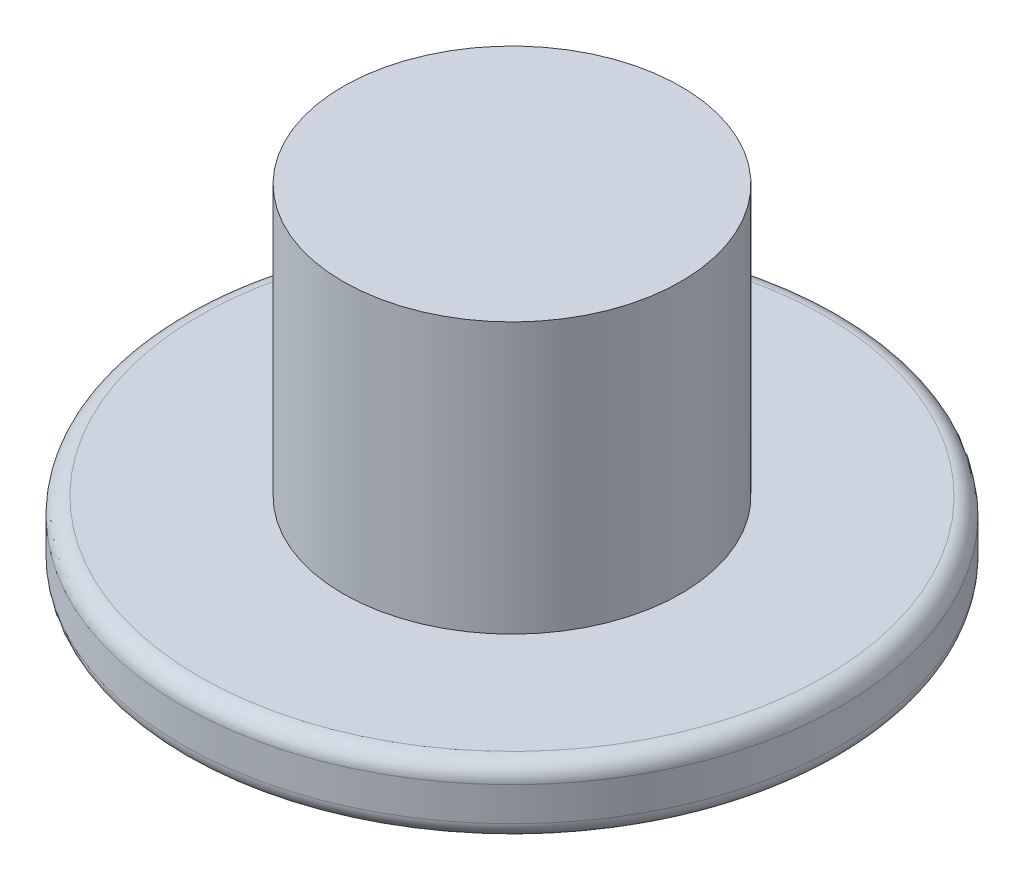
ISO-10303-21;
HEADER;
FILE_DESCRIPTION(('STEP AP214'),'2;1');
FILE_NAME('part.step','',(''),(''),'','','');
FILE_SCHEMA(('AUTOMOTIVE_DESIGN { 1 0 10303 214 1 1 1 1 }'));
ENDSEC;
DATA;
#1=APPLICATION_CONTEXT('core data for automotive mechanical design processes');
#2=APPLICATION_PROTOCOL_DEFINITION('international standard','automotive_design',2000,#1);
#3=PRODUCT_CONTEXT('',#1,'mechanical');
#4=PRODUCT('Part','Part','',(#3));
#5=PRODUCT_RELATED_PRODUCT_CATEGORY('part','',(#4));
#6=PRODUCT_DEFINITION_FORMATION('','',#4);
#7=PRODUCT_DEFINITION_CONTEXT('part definition',#1,'design');
#8=PRODUCT_DEFINITION('design','',#6,#7);
#9=PRODUCT_DEFINITION_SHAPE('','',#8);
#10=(LENGTH_UNIT() NAMED_UNIT(*) SI_UNIT(.MILLI.,.METRE.));
#11=(NAMED_UNIT(*) PLANE_ANGLE_UNIT() SI_UNIT($,.RADIAN.));
#12=(NAMED_UNIT(*) SI_UNIT($,.STERADIAN.) SOLID_ANGLE_UNIT());
#13=UNCERTAINTY_MEASURE_WITH_UNIT(LENGTH_MEASURE(1.E-05),#10,'distance_accuracy_value','');
#14=(GEOMETRIC_REPRESENTATION_CONTEXT(3) GLOBAL_UNCERTAINTY_ASSIGNED_CONTEXT((#13)) GLOBAL_UNIT_ASSIGNED_CONTEXT((#10,
#11,#12)) REPRESENTATION_CONTEXT('',''));
#15=CARTESIAN_POINT('',(0.,0.,0.));
#16=DIRECTION('',(0.,0.,1.));
#17=DIRECTION('',(1.,0.,0.));
#18=AXIS2_PLACEMENT_3D('',#15,#16,#17);
#19=CARTESIAN_POINT('',(-5.40867619744746,0.,40.306737900425));
#20=DIRECTION('',(0.,1.,0.));
#21=DIRECTION('',(0.,0.,1.));
#22=AXIS2_PLACEMENT_3D('',#19,#20,#21);
#23=PLANE('',#22);
#24=CARTESIAN_POINT('',(-5.40867619744746,0.,40.306737900425));
#25=DIRECTION('',(0.,1.,0.));
#26=DIRECTION('',(0.,0.,1.));
#27=AXIS2_PLACEMENT_3D('',#24,#25,#26);
#28=CIRCLE('',#27,9.25);
#29=CARTESIAN_POINT('',(-5.40867619744746,0.,49.556737900425));
#30=VERTEX_POINT('',#29);
#31=EDGE_CURVE('E11',#30,#30,#28,.F.);
#32=ORIENTED_EDGE('',*,*,#31,.T.);
#33=EDGE_LOOP('',(#32));
#34=FACE_BOUND('',#33,.T.);
#35=CARTESIAN_POINT('',(-4.86815187668674,0.,43.656598566275));
#36=CARTESIAN_POINT('',(-4.9265274948518,0.,43.6554012711675));
#37=CARTESIAN_POINT('',(-5.04136766158719,0.,43.6530458773558));
#38=CARTESIAN_POINT('',(-5.21049823293567,0.,43.6287436669947));
#39=CARTESIAN_POINT('',(-5.37284264152484,0.,43.589174889962));
#40=CARTESIAN_POINT('',(-5.52894854622162,0.,43.5342893866982));
#41=CARTESIAN_POINT('',(-5.67994659473248,0.,43.4665765629826));
#42=CARTESIAN_POINT('',(-5.82214463201387,0.,43.3788547315282));
#43=CARTESIAN_POINT('',(-5.95786684100596,0.,43.2768072130683));
#44=CARTESIAN_POINT('',(-6.08890750201257,0.,43.1622742351908));
#45=CARTESIAN_POINT('',(-6.20816961574616,0.,43.0279042492214));
#46=CARTESIAN_POINT('',(-6.31484071900463,0.,42.8752895696739));
#47=CARTESIAN_POINT('',(-6.40903551283288,0.,42.7042639040301));
#48=CARTESIAN_POINT('',(-6.48954892288035,0.,42.5151264404665));
#49=CARTESIAN_POINT('',(-6.55627431986012,0.,42.3073809753617));
#50=CARTESIAN_POINT('',(-6.60980119432697,0.,42.0812801179432));
#51=CARTESIAN_POINT('',(-6.65118264181819,0.,41.8367254712347));
#52=CARTESIAN_POINT('',(-6.66786853251487,0.,41.66694388963));
#53=CARTESIAN_POINT('',(-6.67644514591751,0.,41.5796754893519));
#54=B_SPLINE_CURVE_WITH_KNOTS('',3,(#35,#36,#37,#38,#39,#40,#41,#42,#43,#44,#45,#46,#47,#48,#49,
#50,#51,#52,#53),.UNSPECIFIED.,.F.,.F.,(4,1,1,1,1,1,1,1,1,1,1,1,1,1,1,1,4),(0.,
0.0569713051685908,0.112077514386115,0.16644764094992,0.219897905758325,0.273467231537102,
0.327713706604801,0.382641522400875,0.43917288812717,0.497361289307803,0.557599765805196,
0.620640083609898,0.68767803671055,0.758012520546466,0.833449835749434,0.914392560943234,1.),.UNSPECIFIED.);
#55=CARTESIAN_POINT('',(-4.86815187668674,0.,43.656598566275));
#56=VERTEX_POINT('',#55);
#57=CARTESIAN_POINT('',(-6.67644514591751,0.,41.5796754893519));
#58=VERTEX_POINT('',#57);
#59=EDGE_CURVE('E55',#56,#58,#54,.T.);
#60=ORIENTED_EDGE('',*,*,#59,.T.);
#61=DIRECTION('',(-1.,0.,0.));
#62=VECTOR('',#61,1.);
#63=CARTESIAN_POINT('',(-6.67644514591751,0.,41.5796754893519));
#64=LINE('',#63,#62);
#65=CARTESIAN_POINT('',(-7.81767110745597,0.,41.5796754893519));
#66=VERTEX_POINT('',#65);
#67=EDGE_CURVE('E324',#58,#66,#64,.T.);
#68=ORIENTED_EDGE('',*,*,#67,.T.);
#69=CARTESIAN_POINT('',(-7.81767110745597,0.,41.5796754893519));
#70=CARTESIAN_POINT('',(-7.81231042562037,0.,41.6958013678259));
#71=CARTESIAN_POINT('',(-7.80182566746402,0.,41.9229276530318));
#72=CARTESIAN_POINT('',(-7.75526793540313,0.,42.2538760267309));
#73=CARTESIAN_POINT('',(-7.67984772636302,0.,42.5657138157491));
#74=CARTESIAN_POINT('',(-7.58465150107638,0.,42.8610845727552));
#75=CARTESIAN_POINT('',(-7.45766238996081,0.,43.136296005763));
#76=CARTESIAN_POINT('',(-7.31114235756878,0.,43.3961457559105));
#77=CARTESIAN_POINT('',(-7.13425901368639,0.,43.6351878830934));
#78=CARTESIAN_POINT('',(-6.93437117141763,0.,43.8538005312364));
#79=CARTESIAN_POINT('',(-6.71738585930735,0.,44.0524186303767));
#80=CARTESIAN_POINT('',(-6.48412563339401,0.,44.2236832451403));
#81=CARTESIAN_POINT('',(-6.23853330832444,0.,44.3696259850754));
#82=CARTESIAN_POINT('',(-5.98056059110526,0.,44.4887162276268));
#83=CARTESIAN_POINT('',(-5.70970226989822,0.,44.5809255286656));
#84=CARTESIAN_POINT('',(-5.4267303935295,0.,44.6480239257463));
#85=CARTESIAN_POINT('',(-5.13074224993563,0.,44.6883820177305));
#86=CARTESIAN_POINT('',(-4.92897463181016,0.,44.6928134991708));
#87=CARTESIAN_POINT('',(-4.8266855305329,0.,44.6950601047365));
#88=B_SPLINE_CURVE_WITH_KNOTS('',3,(#69,#70,#71,#72,#73,#74,#75,#76,#77,#78,#79,#80,#81,#82,#83,
#84,#85,#86,#87),.UNSPECIFIED.,.F.,.F.,(4,1,1,1,1,1,1,1,1,1,1,1,1,1,1,1,4),(0.,
0.0721852611632254,0.141184466632902,0.207190341816113,0.271289738720126,0.333603347161626,
0.395138342452934,0.456287150040092,0.517858367692974,0.578902257442722,0.638706565825344,
0.697285504225467,0.756078148420719,0.814867237218555,0.874716965274666,0.936485898250662,1.),.UNSPECIFIED.);
#89=CARTESIAN_POINT('',(-4.8266855305329,0.,44.6950601047365));
#90=VERTEX_POINT('',#89);
#91=EDGE_CURVE('E328',#66,#90,#88,.T.);
#92=ORIENTED_EDGE('',*,*,#91,.T.);
#93=CARTESIAN_POINT('',(-4.8266855305329,0.,44.6950601047365));
#94=CARTESIAN_POINT('',(-4.71958862135008,0.,44.6928693658412));
#95=CARTESIAN_POINT('',(-4.50943487041433,0.,44.6885705303315));
#96=CARTESIAN_POINT('',(-4.20340039323722,0.,44.6481179639586));
#97=CARTESIAN_POINT('',(-3.91376677365951,0.,44.5828882299221));
#98=CARTESIAN_POINT('',(-3.64044920740433,0.,44.4938078637142));
#99=CARTESIAN_POINT('',(-3.38394565890612,0.,44.3748623743126));
#100=CARTESIAN_POINT('',(-3.14375031953804,0.,44.2314272316589));
#101=CARTESIAN_POINT('',(-2.92217206443584,0.,44.0590233700213));
#102=CARTESIAN_POINT('',(-2.71760269182176,0.,43.8661142137759));
#103=CARTESIAN_POINT('',(-2.53691503816966,0.,43.6539125531114));
#104=CARTESIAN_POINT('',(-2.37371697699652,0.,43.4357440388615));
#105=CARTESIAN_POINT('',(-2.2388179791637,0.,43.2071839649847));
#106=CARTESIAN_POINT('',(-2.12580662295695,0.,42.9724058894584));
#107=CARTESIAN_POINT('',(-2.03884260302685,0.,42.7294828916048));
#108=CARTESIAN_POINT('',(-1.97742888440221,0.,42.4794035605303));
#109=CARTESIAN_POINT('',(-1.94061647491408,0.,42.2219979643347));
#110=CARTESIAN_POINT('',(-1.93559197277444,0.,42.0479429838367));
#111=CARTESIAN_POINT('',(-1.93305572284059,0.,41.9600841431981));
#112=B_SPLINE_CURVE_WITH_KNOTS('',3,(#93,#94,#95,#96,#97,#98,#99,#100,#101,#102,#103,#104,#105,
#106,#107,#108,#109,#110,#111),.UNSPECIFIED.,.F.,.F.,(4,1,1,1,1,1,1,1,1,1,1,1,1,1,1,1,4),(0.,
0.0722951466281055,0.141863069198499,0.208024753889536,0.272578644258576,0.335589612500515,
0.398578358569926,0.461082805887884,0.524813714924765,0.588114162474487,0.649073799790775,
0.708582834630701,0.767034895639372,0.824801028867428,0.882481561455874,0.940679469587159,1.),.UNSPECIFIED.);
#113=CARTESIAN_POINT('',(-1.93305572284059,0.,41.9600841431981));
#114=VERTEX_POINT('',#113);
#115=EDGE_CURVE('E340',#90,#114,#112,.T.);
#116=ORIENTED_EDGE('',*,*,#115,.T.);
#117=CARTESIAN_POINT('',(-1.93305572284059,0.,41.9600841431981));
#118=CARTESIAN_POINT('',(-1.93767093072679,0.,41.8371840428743));
#119=CARTESIAN_POINT('',(-1.94683812186759,0.,41.5930674746351));
#120=CARTESIAN_POINT('',(-2.01742833242824,0.,41.2319110221315));
#121=CARTESIAN_POINT('',(-2.13609874690406,0.,40.8823869882711));
#122=CARTESIAN_POINT('',(-2.27317442816915,0.,40.597782754314));
#123=CARTESIAN_POINT('',(-2.41180994311675,0.,40.3677330957246));
#124=CARTESIAN_POINT('',(-2.53903480598306,0.,40.177847762636));
#125=CARTESIAN_POINT('',(-2.68849110352186,0.,39.9725240754956));
#126=CARTESIAN_POINT('',(-2.86338400223585,0.,39.7531364851328));
#127=CARTESIAN_POINT('',(-3.05675904943346,0.,39.5146653192571));
#128=CARTESIAN_POINT('',(-3.27629786174428,0.,39.2632623936409));
#129=CARTESIAN_POINT('',(-3.51520538059535,0.,38.9938378797796));
#130=CARTESIAN_POINT('',(-3.68559050659647,0.,38.8124198690723));
#131=CARTESIAN_POINT('',(-3.77380091514828,0.,38.7184976047365));
#132=B_SPLINE_CURVE_WITH_KNOTS('',3,(#117,#118,#119,#120,#121,#122,#123,#124,#125,#126,#127,
#128,#129,#130,#131),.UNSPECIFIED.,.F.,.F.,(4,1,1,1,1,1,1,1,1,1,1,1,4),(0.,0.0963129234548143,
0.191306437414885,0.287260269542857,0.385041783312048,0.438291931212015,0.49775044955736,
0.564191602474391,0.637336305933296,0.717694708156952,0.804880874567301,0.89898450542815,1.),.UNSPECIFIED.);
#133=CARTESIAN_POINT('',(-3.77380091514828,0.,38.7184976047365));
#134=VERTEX_POINT('',#133);
#135=EDGE_CURVE('E349',#114,#134,#132,.T.);
#136=ORIENTED_EDGE('',*,*,#135,.T.);
#137=DIRECTION('',(-0.706818929896772,0.,-0.707394515344572));
#138=VECTOR('',#137,1.);
#139=CARTESIAN_POINT('',(-3.77380091514828,0.,38.7184976047365));
#140=LINE('',#139,#138);
#141=CARTESIAN_POINT('',(-5.98774322284059,0.,36.5027524124289));
#142=VERTEX_POINT('',#141);
#143=EDGE_CURVE('E358',#134,#142,#140,.T.);
#144=ORIENTED_EDGE('',*,*,#143,.T.);
#145=DIRECTION('',(1.,0.,0.));
#146=VECTOR('',#145,1.);
#147=CARTESIAN_POINT('',(-5.98774322284059,0.,36.5027524124289));
#148=LINE('',#147,#146);
#149=CARTESIAN_POINT('',(-1.81767110745597,0.,36.5027524124289));
#150=VERTEX_POINT('',#149);
#151=EDGE_CURVE('E365',#142,#150,#148,.T.);
#152=ORIENTED_EDGE('',*,*,#151,.T.);
#153=DIRECTION('',(0.,0.,-1.));
#154=VECTOR('',#153,1.);
#155=CARTESIAN_POINT('',(-1.81767110745597,0.,36.5027524124289));
#156=LINE('',#155,#154);
#157=CARTESIAN_POINT('',(-1.81767110745597,0.,35.4642908739673));
#158=VERTEX_POINT('',#157);
#159=EDGE_CURVE('E240',#150,#158,#156,.T.);
#160=ORIENTED_EDGE('',*,*,#159,.T.);
#161=DIRECTION('',(-1.,0.,0.));
#162=VECTOR('',#161,1.);
#163=CARTESIAN_POINT('',(-1.81767110745597,0.,35.4642908739673));
#164=LINE('',#163,#162);
#165=CARTESIAN_POINT('',(-8.16382495360982,0.,35.4642908739673));
#166=VERTEX_POINT('',#165);
#167=EDGE_CURVE('E370',#158,#166,#164,.T.);
#168=ORIENTED_EDGE('',*,*,#167,.T.);
#169=DIRECTION('',(0.671272146490602,0.,0.74121097222444));
#170=VECTOR('',#169,1.);
#171=CARTESIAN_POINT('',(-8.16382495360982,0.,35.4642908739673));
#172=LINE('',#171,#170);
#173=CARTESIAN_POINT('',(-4.7203153382252,0.,39.2665745278135));
#174=VERTEX_POINT('',#173);
#175=EDGE_CURVE('E374',#166,#174,#172,.T.);
#176=ORIENTED_EDGE('',*,*,#175,.T.);
#177=CARTESIAN_POINT('',(-4.7203153382252,0.,39.2665745278135));
#178=CARTESIAN_POINT('',(-4.63829550392152,0.,39.3540477623207));
#179=CARTESIAN_POINT('',(-4.4808979427656,0.,39.5219104981422));
#180=CARTESIAN_POINT('',(-4.25906836444703,0.,39.7676345886698));
#181=CARTESIAN_POINT('',(-4.05892842312747,0.,39.9948026760784));
#182=CARTESIAN_POINT('',(-3.87941109660487,0.,40.2032507678402));
#183=CARTESIAN_POINT('',(-3.72521721116667,0.,40.3957806275165));
#184=CARTESIAN_POINT('',(-3.59219864359354,0.,40.5695598055908));
#185=CARTESIAN_POINT('',(-3.48186118996338,0.,40.7254089202924));
#186=CARTESIAN_POINT('',(-3.36727521869819,0.,40.9088563013246));
#187=CARTESIAN_POINT('',(-3.2537322747201,0.,41.128759826927));
#188=CARTESIAN_POINT('',(-3.15714334615502,0.,41.3970112500813));
#189=CARTESIAN_POINT('',(-3.09918525756176,0.,41.6709541421488));
#190=CARTESIAN_POINT('',(-3.09099834054498,0.,41.855248912581));
#191=CARTESIAN_POINT('',(-3.08690187668674,0.,41.9474639508904));
#192=B_SPLINE_CURVE_WITH_KNOTS('',3,(#177,#178,#179,#180,#181,#182,#183,#184,#185,#186,#187,
#188,#189,#190,#191),.UNSPECIFIED.,.F.,.F.,(4,1,1,1,1,1,1,1,1,1,1,1,4),(0.,0.111796703885441,
0.214539918133527,0.308625582047602,0.394072981184507,0.470989580125928,0.538563461408388,
0.598097997336717,0.648937472604036,0.740149715004451,0.828231221971267,0.914052556081118,1.),.UNSPECIFIED.);
#193=CARTESIAN_POINT('',(-3.08690187668674,0.,41.9474639508904));
#194=VERTEX_POINT('',#193);
#195=EDGE_CURVE('E154',#174,#194,#192,.T.);
#196=ORIENTED_EDGE('',*,*,#195,.T.);
#197=CARTESIAN_POINT('',(-3.08690187668674,0.,41.9474639508904));
#198=CARTESIAN_POINT('',(-3.08791141743485,0.,42.0046706691355));
#199=CARTESIAN_POINT('',(-3.08990899826816,0.,42.1178657473107));
#200=CARTESIAN_POINT('',(-3.11714272444165,0.,42.2836263651644));
#201=CARTESIAN_POINT('',(-3.15550631850367,0.,42.4444049407286));
#202=CARTESIAN_POINT('',(-3.21484138084103,0.,42.5976166387461));
#203=CARTESIAN_POINT('',(-3.28632921372547,0.,42.7462757341049));
#204=CARTESIAN_POINT('',(-3.37574777383079,0.,42.8884604821643));
#205=CARTESIAN_POINT('',(-3.48312356463485,0.,43.0228519659278));
#206=CARTESIAN_POINT('',(-3.60256902733585,0.,43.1524739095849));
#207=CARTESIAN_POINT('',(-3.73467884840879,0.,43.2695078436411));
#208=CARTESIAN_POINT('',(-3.87421839062705,0.,43.3744701642076));
#209=CARTESIAN_POINT('',(-4.0229036535834,0.,43.4597132228365));
#210=CARTESIAN_POINT('',(-4.1766693588622,0.,43.5342597696784));
#211=CARTESIAN_POINT('',(-4.34029540458553,0.,43.5871083945482));
#212=CARTESIAN_POINT('',(-4.50975966758478,0.,43.626456912421));
#213=CARTESIAN_POINT('',(-4.68639278137057,0.,43.6537144248872));
#214=CARTESIAN_POINT('',(-4.80674877592735,0.,43.6556242259047));
#215=CARTESIAN_POINT('',(-4.86815187668674,0.,43.656598566275));
#216=B_SPLINE_CURVE_WITH_KNOTS('',3,(#197,#198,#199,#200,#201,#202,#203,#204,#205,#206,#207,
#208,#209,#210,#211,#212,#213,#214,#215),.UNSPECIFIED.,.F.,.F.,(4,1,1,1,1,1,1,1,1,1,1,1,1,1,1,1,
4),(0.,0.0624645579460315,0.123598778898255,0.183188668078303,0.242854553261223,
0.302791066145277,0.363304438937391,0.425993138279142,0.490604073915263,0.555743866473249,
0.618679913682442,0.681099546765628,0.742813418463335,0.805136180313869,0.86855722512849,
0.932940656763704,1.),.UNSPECIFIED.);
#217=EDGE_CURVE('E325',#194,#56,#216,.T.);
#218=ORIENTED_EDGE('',*,*,#217,.T.);
#219=EDGE_LOOP('',(#60,#68,#92,#116,#136,#144,#152,#160,#168,#176,#196,#218));
#220=FACE_BOUND('',#219,.T.);
#221=ADVANCED_FACE('F39',(#34,#220),#23,.F.);
#222=CARTESIAN_POINT('',(-5.40867619744746,2.,40.306737900425));
#223=DIRECTION('',(0.,-1.,0.));
#224=DIRECTION('',(0.,0.,-1.));
#225=AXIS2_PLACEMENT_3D('',#222,#223,#224);
#226=CYLINDRICAL_SURFACE('',#225,9.75);
#227=CARTESIAN_POINT('',(-5.40867619744746,1.5,40.306737900425));
#228=DIRECTION('',(0.,1.,0.));
#229=DIRECTION('',(0.,0.,1.));
#230=AXIS2_PLACEMENT_3D('',#227,#228,#229);
#231=CIRCLE('',#230,9.75);
#232=CARTESIAN_POINT('',(-5.40867619744746,1.5,50.056737900425));
#233=VERTEX_POINT('',#232);
#234=EDGE_CURVE('E48',#233,#233,#231,.F.);
#235=ORIENTED_EDGE('',*,*,#234,.T.);
#236=EDGE_LOOP('',(#235));
#237=FACE_BOUND('',#236,.T.);
#238=CARTESIAN_POINT('',(-5.40867619744746,0.5,40.306737900425));
#239=DIRECTION('',(0.,1.,0.));
#240=DIRECTION('',(0.,0.,1.));
#241=AXIS2_PLACEMENT_3D('',#238,#239,#240);
#242=CIRCLE('',#241,9.75);
#243=CARTESIAN_POINT('',(-5.40867619744746,0.5,50.056737900425));
#244=VERTEX_POINT('',#243);
#245=EDGE_CURVE('E279',#244,#244,#242,.T.);
#246=ORIENTED_EDGE('',*,*,#245,.T.);
#247=EDGE_LOOP('',(#246));
#248=FACE_BOUND('',#247,.T.);
#249=ADVANCED_FACE('F286',(#237,#248),#226,.T.);
#250=CARTESIAN_POINT('',(-5.40867619744746,2.,40.306737900425));
#251=DIRECTION('',(0.,1.,0.));
#252=DIRECTION('',(0.,0.,1.));
#253=AXIS2_PLACEMENT_3D('',#250,#251,#252);
#254=PLANE('',#253);
#255=CARTESIAN_POINT('',(-5.40867619744746,2.,40.306737900425));
#256=DIRECTION('',(0.,1.,0.));
#257=DIRECTION('',(0.,0.,1.));
#258=AXIS2_PLACEMENT_3D('',#255,#256,#257);
#259=CIRCLE('',#258,9.25);
#260=CARTESIAN_POINT('',(-5.40867619744746,2.,49.556737900425));
#261=VERTEX_POINT('',#260);
#262=EDGE_CURVE('E275',#261,#261,#259,.T.);
#263=ORIENTED_EDGE('',*,*,#262,.T.);
#264=EDGE_LOOP('',(#263));
#265=FACE_BOUND('',#264,.T.);
#266=CARTESIAN_POINT('',(-5.40867619744746,2.,40.306737900425));
#267=DIRECTION('',(0.,1.,0.));
#268=DIRECTION('',(0.,0.,1.));
#269=AXIS2_PLACEMENT_3D('',#266,#267,#268);
#270=CIRCLE('',#269,5.);
#271=CARTESIAN_POINT('',(-5.40867619744746,2.,45.306737900425));
#272=VERTEX_POINT('',#271);
#273=EDGE_CURVE('E271',#272,#272,#270,.T.);
#274=ORIENTED_EDGE('',*,*,#273,.F.);
#275=EDGE_LOOP('',(#274));
#276=FACE_BOUND('',#275,.T.);
#277=ADVANCED_FACE('F294',(#265,#276),#254,.T.);
#278=CARTESIAN_POINT('',(-5.40867619744746,10.,40.306737900425));
#279=DIRECTION('',(0.,-1.,0.));
#280=DIRECTION('',(0.,0.,-1.));
#281=AXIS2_PLACEMENT_3D('',#278,#279,#280);
#282=CYLINDRICAL_SURFACE('',#281,5.);
#283=CARTESIAN_POINT('',(-5.40867619744746,10.,40.306737900425));
#284=DIRECTION('',(0.,1.,0.));
#285=DIRECTION('',(0.,0.,1.));
#286=AXIS2_PLACEMENT_3D('',#283,#284,#285);
#287=CIRCLE('',#286,5.);
#288=CARTESIAN_POINT('',(-5.40867619744746,10.,45.306737900425));
#289=VERTEX_POINT('',#288);
#290=EDGE_CURVE('E267',#289,#289,#287,.T.);
#291=ORIENTED_EDGE('',*,*,#290,.F.);
#292=EDGE_LOOP('',(#291));
#293=FACE_BOUND('',#292,.T.);
#294=ORIENTED_EDGE('',*,*,#273,.T.);
#295=EDGE_LOOP('',(#294));
#296=FACE_BOUND('',#295,.T.);
#297=ADVANCED_FACE('F297',(#293,#296),#282,.T.);
#298=CARTESIAN_POINT('',(-5.40867619744746,10.,40.306737900425));
#299=DIRECTION('',(0.,1.,0.));
#300=DIRECTION('',(0.,0.,1.));
#301=AXIS2_PLACEMENT_3D('',#298,#299,#300);
#302=PLANE('',#301);
#303=ORIENTED_EDGE('',*,*,#290,.T.);
#304=EDGE_LOOP('',(#303));
#305=FACE_BOUND('',#304,.T.);
#306=ADVANCED_FACE('F302',(#305),#302,.T.);
#307=CARTESIAN_POINT('',(-4.86815187668674,0.5,43.656598566275));
#308=CARTESIAN_POINT('',(-4.9265274948518,0.5,43.6554012711675));
#309=CARTESIAN_POINT('',(-5.04136766158719,0.5,43.6530458773558));
#310=CARTESIAN_POINT('',(-5.21049823293567,0.5,43.6287436669947));
#311=CARTESIAN_POINT('',(-5.37284264152484,0.5,43.589174889962));
#312=CARTESIAN_POINT('',(-5.52894854622162,0.5,43.5342893866982));
#313=CARTESIAN_POINT('',(-5.67994659473248,0.5,43.4665765629826));
#314=CARTESIAN_POINT('',(-5.82214463201387,0.5,43.3788547315282));
#315=CARTESIAN_POINT('',(-5.95786684100596,0.5,43.2768072130683));
#316=CARTESIAN_POINT('',(-6.08890750201257,0.5,43.1622742351908));
#317=CARTESIAN_POINT('',(-6.20816961574616,0.5,43.0279042492214));
#318=CARTESIAN_POINT('',(-6.31484071900463,0.5,42.8752895696739));
#319=CARTESIAN_POINT('',(-6.40903551283288,0.5,42.7042639040301));
#320=CARTESIAN_POINT('',(-6.48954892288035,0.5,42.5151264404665));
#321=CARTESIAN_POINT('',(-6.55627431986012,0.5,42.3073809753617));
#322=CARTESIAN_POINT('',(-6.60980119432697,0.5,42.0812801179432));
#323=CARTESIAN_POINT('',(-6.65118264181819,0.5,41.8367254712347));
#324=CARTESIAN_POINT('',(-6.66786853251487,0.5,41.66694388963));
#325=CARTESIAN_POINT('',(-6.67644514591751,0.5,41.5796754893519));
#326=B_SPLINE_CURVE_WITH_KNOTS('',3,(#307,#308,#309,#310,#311,#312,#313,#314,#315,#316,#317,
#318,#319,#320,#321,#322,#323,#324,#325),.UNSPECIFIED.,.F.,.F.,(4,1,1,1,1,1,1,1,1,1,1,1,1,1,1,1,
4),(0.,0.0569713051685908,0.112077514386115,0.16644764094992,0.219897905758325,
0.273467231537102,0.327713706604801,0.382641522400875,0.43917288812717,0.497361289307803,
0.557599765805196,0.620640083609898,0.68767803671055,0.758012520546466,0.833449835749434,
0.914392560943234,1.),.UNSPECIFIED.);
#327=DIRECTION('',(0.,-1.,0.));
#328=VECTOR('',#327,1.);
#329=SURFACE_OF_LINEAR_EXTRUSION('',#326,#328);
#330=ORIENTED_EDGE('',*,*,#59,.F.);
#331=DIRECTION('',(0.,-1.,0.));
#332=VECTOR('',#331,1.);
#333=CARTESIAN_POINT('',(-4.86815187668674,0.5,43.656598566275));
#334=LINE('',#333,#332);
#335=CARTESIAN_POINT('',(-4.86815187668674,0.5,43.656598566275));
#336=VERTEX_POINT('',#335);
#337=EDGE_CURVE('E162',#336,#56,#334,.T.);
#338=ORIENTED_EDGE('',*,*,#337,.F.);
#339=CARTESIAN_POINT('',(-6.67644514591751,0.5,41.5796754893519));
#340=VERTEX_POINT('',#339);
#341=EDGE_CURVE('E388',#336,#340,#326,.T.);
#342=ORIENTED_EDGE('',*,*,#341,.T.);
#343=DIRECTION('',(0.,-1.,0.));
#344=VECTOR('',#343,1.);
#345=CARTESIAN_POINT('',(-6.67644514591751,0.5,41.5796754893519));
#346=LINE('',#345,#344);
#347=EDGE_CURVE('E264',#340,#58,#346,.T.);
#348=ORIENTED_EDGE('',*,*,#347,.T.);
#349=EDGE_LOOP('',(#330,#338,#342,#348));
#350=FACE_BOUND('',#349,.T.);
#351=ADVANCED_FACE('F308',(#350),#329,.T.);
#352=CARTESIAN_POINT('',(-6.67644514591751,0.5,41.5796754893519));
#353=DIRECTION('',(0.,0.,1.));
#354=DIRECTION('',(1.,0.,0.));
#355=AXIS2_PLACEMENT_3D('',#352,#353,#354);
#356=PLANE('',#355);
#357=ORIENTED_EDGE('',*,*,#67,.F.);
#358=ORIENTED_EDGE('',*,*,#347,.F.);
#359=DIRECTION('',(-1.,0.,0.));
#360=VECTOR('',#359,1.);
#361=CARTESIAN_POINT('',(-6.67644514591751,0.5,41.5796754893519));
#362=LINE('',#361,#360);
#363=CARTESIAN_POINT('',(-7.81767110745597,0.5,41.5796754893519));
#364=VERTEX_POINT('',#363);
#365=EDGE_CURVE('E112',#340,#364,#362,.T.);
#366=ORIENTED_EDGE('',*,*,#365,.T.);
#367=DIRECTION('',(0.,-1.,0.));
#368=VECTOR('',#367,1.);
#369=CARTESIAN_POINT('',(-7.81767110745597,0.5,41.5796754893519));
#370=LINE('',#369,#368);
#371=EDGE_CURVE('E261',#364,#66,#370,.T.);
#372=ORIENTED_EDGE('',*,*,#371,.T.);
#373=EDGE_LOOP('',(#357,#358,#366,#372));
#374=FACE_BOUND('',#373,.T.);
#375=ADVANCED_FACE('F411',(#374),#356,.T.);
#376=CARTESIAN_POINT('',(-7.81767110745597,0.5,41.5796754893519));
#377=CARTESIAN_POINT('',(-7.81231042562037,0.5,41.6958013678259));
#378=CARTESIAN_POINT('',(-7.80182566746402,0.5,41.9229276530318));
#379=CARTESIAN_POINT('',(-7.75526793540313,0.5,42.2538760267309));
#380=CARTESIAN_POINT('',(-7.67984772636302,0.5,42.5657138157491));
#381=CARTESIAN_POINT('',(-7.58465150107638,0.5,42.8610845727552));
#382=CARTESIAN_POINT('',(-7.45766238996081,0.5,43.136296005763));
#383=CARTESIAN_POINT('',(-7.31114235756878,0.5,43.3961457559105));
#384=CARTESIAN_POINT('',(-7.13425901368639,0.5,43.6351878830934));
#385=CARTESIAN_POINT('',(-6.93437117141763,0.5,43.8538005312364));
#386=CARTESIAN_POINT('',(-6.71738585930735,0.5,44.0524186303767));
#387=CARTESIAN_POINT('',(-6.48412563339401,0.5,44.2236832451403));
#388=CARTESIAN_POINT('',(-6.23853330832444,0.5,44.3696259850754));
#389=CARTESIAN_POINT('',(-5.98056059110526,0.5,44.4887162276268));
#390=CARTESIAN_POINT('',(-5.70970226989822,0.5,44.5809255286656));
#391=CARTESIAN_POINT('',(-5.4267303935295,0.5,44.6480239257463));
#392=CARTESIAN_POINT('',(-5.13074224993563,0.5,44.6883820177305));
#393=CARTESIAN_POINT('',(-4.92897463181016,0.5,44.6928134991708));
#394=CARTESIAN_POINT('',(-4.8266855305329,0.5,44.6950601047365));
#395=B_SPLINE_CURVE_WITH_KNOTS('',3,(#376,#377,#378,#379,#380,#381,#382,#383,#384,#385,#386,
#387,#388,#389,#390,#391,#392,#393,#394),.UNSPECIFIED.,.F.,.F.,(4,1,1,1,1,1,1,1,1,1,1,1,1,1,1,1,
4),(0.,0.0721852611632254,0.141184466632902,0.207190341816113,0.271289738720126,
0.333603347161626,0.395138342452934,0.456287150040092,0.517858367692974,0.578902257442722,
0.638706565825344,0.697285504225467,0.756078148420719,0.814867237218555,0.874716965274666,
0.936485898250662,1.),.UNSPECIFIED.);
#396=DIRECTION('',(0.,-1.,0.));
#397=VECTOR('',#396,1.);
#398=SURFACE_OF_LINEAR_EXTRUSION('',#395,#397);
#399=ORIENTED_EDGE('',*,*,#91,.F.);
#400=ORIENTED_EDGE('',*,*,#371,.F.);
#401=CARTESIAN_POINT('',(-4.8266855305329,0.5,44.6950601047365));
#402=VERTEX_POINT('',#401);
#403=EDGE_CURVE('E400',#364,#402,#395,.T.);
#404=ORIENTED_EDGE('',*,*,#403,.T.);
#405=DIRECTION('',(0.,-1.,0.));
#406=VECTOR('',#405,1.);
#407=CARTESIAN_POINT('',(-4.8266855305329,0.5,44.6950601047365));
#408=LINE('',#407,#406);
#409=EDGE_CURVE('E258',#402,#90,#408,.T.);
#410=ORIENTED_EDGE('',*,*,#409,.T.);
#411=EDGE_LOOP('',(#399,#400,#404,#410));
#412=FACE_BOUND('',#411,.T.);
#413=ADVANCED_FACE('F413',(#412),#398,.T.);
#414=CARTESIAN_POINT('',(-4.8266855305329,0.5,44.6950601047365));
#415=CARTESIAN_POINT('',(-4.71958862135008,0.5,44.6928693658412));
#416=CARTESIAN_POINT('',(-4.50943487041433,0.5,44.6885705303315));
#417=CARTESIAN_POINT('',(-4.20340039323722,0.5,44.6481179639586));
#418=CARTESIAN_POINT('',(-3.91376677365951,0.5,44.5828882299221));
#419=CARTESIAN_POINT('',(-3.64044920740433,0.5,44.4938078637142));
#420=CARTESIAN_POINT('',(-3.38394565890612,0.5,44.3748623743126));
#421=CARTESIAN_POINT('',(-3.14375031953804,0.5,44.2314272316589));
#422=CARTESIAN_POINT('',(-2.92217206443584,0.5,44.0590233700213));
#423=CARTESIAN_POINT('',(-2.71760269182176,0.5,43.8661142137759));
#424=CARTESIAN_POINT('',(-2.53691503816966,0.5,43.6539125531114));
#425=CARTESIAN_POINT('',(-2.37371697699652,0.5,43.4357440388615));
#426=CARTESIAN_POINT('',(-2.2388179791637,0.5,43.2071839649847));
#427=CARTESIAN_POINT('',(-2.12580662295695,0.5,42.9724058894584));
#428=CARTESIAN_POINT('',(-2.03884260302685,0.5,42.7294828916048));
#429=CARTESIAN_POINT('',(-1.97742888440221,0.5,42.4794035605303));
#430=CARTESIAN_POINT('',(-1.94061647491408,0.5,42.2219979643347));
#431=CARTESIAN_POINT('',(-1.93559197277444,0.5,42.0479429838367));
#432=CARTESIAN_POINT('',(-1.93305572284059,0.5,41.9600841431981));
#433=B_SPLINE_CURVE_WITH_KNOTS('',3,(#414,#415,#416,#417,#418,#419,#420,#421,#422,#423,#424,
#425,#426,#427,#428,#429,#430,#431,#432),.UNSPECIFIED.,.F.,.F.,(4,1,1,1,1,1,1,1,1,1,1,1,1,1,1,1,
4),(0.,0.0722951466281055,0.141863069198499,0.208024753889536,0.272578644258576,
0.335589612500515,0.398578358569926,0.461082805887884,0.524813714924765,0.588114162474487,
0.649073799790775,0.708582834630701,0.767034895639372,0.824801028867428,0.882481561455874,
0.940679469587159,1.),.UNSPECIFIED.);
#434=DIRECTION('',(0.,-1.,0.));
#435=VECTOR('',#434,1.);
#436=SURFACE_OF_LINEAR_EXTRUSION('',#433,#435);
#437=ORIENTED_EDGE('',*,*,#115,.F.);
#438=ORIENTED_EDGE('',*,*,#409,.F.);
#439=CARTESIAN_POINT('',(-1.93305572284059,0.5,41.9600841431981));
#440=VERTEX_POINT('',#439);
#441=EDGE_CURVE('E214',#402,#440,#433,.T.);
#442=ORIENTED_EDGE('',*,*,#441,.T.);
#443=DIRECTION('',(0.,-1.,0.));
#444=VECTOR('',#443,1.);
#445=CARTESIAN_POINT('',(-1.93305572284059,0.5,41.9600841431981));
#446=LINE('',#445,#444);
#447=EDGE_CURVE('E255',#440,#114,#446,.T.);
#448=ORIENTED_EDGE('',*,*,#447,.T.);
#449=EDGE_LOOP('',(#437,#438,#442,#448));
#450=FACE_BOUND('',#449,.T.);
#451=ADVANCED_FACE('F203',(#450),#436,.T.);
#452=CARTESIAN_POINT('',(-1.93305572284059,0.5,41.9600841431981));
#453=CARTESIAN_POINT('',(-1.93767093072679,0.5,41.8371840428743));
#454=CARTESIAN_POINT('',(-1.94683812186759,0.5,41.5930674746351));
#455=CARTESIAN_POINT('',(-2.01742833242824,0.5,41.2319110221315));
#456=CARTESIAN_POINT('',(-2.13609874690406,0.5,40.8823869882711));
#457=CARTESIAN_POINT('',(-2.27317442816915,0.5,40.597782754314));
#458=CARTESIAN_POINT('',(-2.41180994311675,0.5,40.3677330957246));
#459=CARTESIAN_POINT('',(-2.53903480598306,0.5,40.177847762636));
#460=CARTESIAN_POINT('',(-2.68849110352186,0.5,39.9725240754956));
#461=CARTESIAN_POINT('',(-2.86338400223585,0.5,39.7531364851328));
#462=CARTESIAN_POINT('',(-3.05675904943346,0.5,39.5146653192571));
#463=CARTESIAN_POINT('',(-3.27629786174428,0.5,39.2632623936409));
#464=CARTESIAN_POINT('',(-3.51520538059535,0.5,38.9938378797796));
#465=CARTESIAN_POINT('',(-3.68559050659647,0.5,38.8124198690723));
#466=CARTESIAN_POINT('',(-3.77380091514828,0.5,38.7184976047365));
#467=B_SPLINE_CURVE_WITH_KNOTS('',3,(#452,#453,#454,#455,#456,#457,#458,#459,#460,#461,#462,
#463,#464,#465,#466),.UNSPECIFIED.,.F.,.F.,(4,1,1,1,1,1,1,1,1,1,1,1,4),(0.,0.0963129234548143,
0.191306437414885,0.287260269542857,0.385041783312048,0.438291931212015,0.49775044955736,
0.564191602474391,0.637336305933296,0.717694708156952,0.804880874567301,0.89898450542815,1.),.UNSPECIFIED.);
#468=DIRECTION('',(0.,-1.,0.));
#469=VECTOR('',#468,1.);
#470=SURFACE_OF_LINEAR_EXTRUSION('',#467,#469);
#471=ORIENTED_EDGE('',*,*,#135,.F.);
#472=ORIENTED_EDGE('',*,*,#447,.F.);
#473=CARTESIAN_POINT('',(-3.77380091514828,0.5,38.7184976047365));
#474=VERTEX_POINT('',#473);
#475=EDGE_CURVE('E207',#440,#474,#467,.T.);
#476=ORIENTED_EDGE('',*,*,#475,.T.);
#477=DIRECTION('',(0.,-1.,0.));
#478=VECTOR('',#477,1.);
#479=CARTESIAN_POINT('',(-3.77380091514828,0.5,38.7184976047365));
#480=LINE('',#479,#478);
#481=EDGE_CURVE('E248',#474,#134,#480,.T.);
#482=ORIENTED_EDGE('',*,*,#481,.T.);
#483=EDGE_LOOP('',(#471,#472,#476,#482));
#484=FACE_BOUND('',#483,.T.);
#485=ADVANCED_FACE('F198',(#484),#470,.T.);
#486=CARTESIAN_POINT('',(-3.77380091514828,0.5,38.7184976047365));
#487=DIRECTION('',(-0.707394515344572,0.,0.706818929896772));
#488=DIRECTION('',(0.706818929896772,0.,0.707394515344572));
#489=AXIS2_PLACEMENT_3D('',#486,#487,#488);
#490=PLANE('',#489);
#491=ORIENTED_EDGE('',*,*,#143,.F.);
#492=ORIENTED_EDGE('',*,*,#481,.F.);
#493=DIRECTION('',(-0.706818929896772,0.,-0.707394515344572));
#494=VECTOR('',#493,1.);
#495=CARTESIAN_POINT('',(-3.77380091514828,0.5,38.7184976047365));
#496=LINE('',#495,#494);
#497=CARTESIAN_POINT('',(-5.98774322284059,0.5,36.5027524124289));
#498=VERTEX_POINT('',#497);
#499=EDGE_CURVE('E213',#474,#498,#496,.T.);
#500=ORIENTED_EDGE('',*,*,#499,.T.);
#501=DIRECTION('',(0.,-1.,0.));
#502=VECTOR('',#501,1.);
#503=CARTESIAN_POINT('',(-5.98774322284059,0.5,36.5027524124289));
#504=LINE('',#503,#502);
#505=EDGE_CURVE('E244',#498,#142,#504,.T.);
#506=ORIENTED_EDGE('',*,*,#505,.T.);
#507=EDGE_LOOP('',(#491,#492,#500,#506));
#508=FACE_BOUND('',#507,.T.);
#509=ADVANCED_FACE('F194',(#508),#490,.T.);
#510=CARTESIAN_POINT('',(-5.98774322284059,0.5,36.5027524124289));
#511=DIRECTION('',(0.,0.,-1.));
#512=DIRECTION('',(-1.,0.,0.));
#513=AXIS2_PLACEMENT_3D('',#510,#511,#512);
#514=PLANE('',#513);
#515=ORIENTED_EDGE('',*,*,#151,.F.);
#516=ORIENTED_EDGE('',*,*,#505,.F.);
#517=DIRECTION('',(1.,0.,0.));
#518=VECTOR('',#517,1.);
#519=CARTESIAN_POINT('',(-5.98774322284059,0.5,36.5027524124289));
#520=LINE('',#519,#518);
#521=CARTESIAN_POINT('',(-1.81767110745597,0.5,36.5027524124289));
#522=VERTEX_POINT('',#521);
#523=EDGE_CURVE('E224',#498,#522,#520,.T.);
#524=ORIENTED_EDGE('',*,*,#523,.T.);
#525=DIRECTION('',(0.,-1.,0.));
#526=VECTOR('',#525,1.);
#527=CARTESIAN_POINT('',(-1.81767110745597,0.5,36.5027524124289));
#528=LINE('',#527,#526);
#529=EDGE_CURVE('E238',#522,#150,#528,.T.);
#530=ORIENTED_EDGE('',*,*,#529,.T.);
#531=EDGE_LOOP('',(#515,#516,#524,#530));
#532=FACE_BOUND('',#531,.T.);
#533=ADVANCED_FACE('F190',(#532),#514,.T.);
#534=CARTESIAN_POINT('',(-1.81767110745597,0.5,36.5027524124289));
#535=DIRECTION('',(-1.,0.,0.));
#536=DIRECTION('',(0.,0.,1.));
#537=AXIS2_PLACEMENT_3D('',#534,#535,#536);
#538=PLANE('',#537);
#539=ORIENTED_EDGE('',*,*,#159,.F.);
#540=ORIENTED_EDGE('',*,*,#529,.F.);
#541=DIRECTION('',(0.,0.,-1.));
#542=VECTOR('',#541,1.);
#543=CARTESIAN_POINT('',(-1.81767110745597,0.5,36.5027524124289));
#544=LINE('',#543,#542);
#545=CARTESIAN_POINT('',(-1.81767110745597,0.5,35.4642908739673));
#546=VERTEX_POINT('',#545);
#547=EDGE_CURVE('E227',#522,#546,#544,.T.);
#548=ORIENTED_EDGE('',*,*,#547,.T.);
#549=DIRECTION('',(0.,-1.,0.));
#550=VECTOR('',#549,1.);
#551=CARTESIAN_POINT('',(-1.81767110745597,0.5,35.4642908739673));
#552=LINE('',#551,#550);
#553=EDGE_CURVE('E232',#546,#158,#552,.T.);
#554=ORIENTED_EDGE('',*,*,#553,.T.);
#555=EDGE_LOOP('',(#539,#540,#548,#554));
#556=FACE_BOUND('',#555,.T.);
#557=ADVANCED_FACE('F186',(#556),#538,.T.);
#558=CARTESIAN_POINT('',(-1.81767110745597,0.5,35.4642908739673));
#559=DIRECTION('',(0.,0.,1.));
#560=DIRECTION('',(1.,0.,0.));
#561=AXIS2_PLACEMENT_3D('',#558,#559,#560);
#562=PLANE('',#561);
#563=ORIENTED_EDGE('',*,*,#167,.F.);
#564=ORIENTED_EDGE('',*,*,#553,.F.);
#565=DIRECTION('',(-1.,0.,0.));
#566=VECTOR('',#565,1.);
#567=CARTESIAN_POINT('',(-1.81767110745597,0.5,35.4642908739673));
#568=LINE('',#567,#566);
#569=CARTESIAN_POINT('',(-8.16382495360982,0.5,35.4642908739673));
#570=VERTEX_POINT('',#569);
#571=EDGE_CURVE('E150',#546,#570,#568,.T.);
#572=ORIENTED_EDGE('',*,*,#571,.T.);
#573=DIRECTION('',(0.,-1.,0.));
#574=VECTOR('',#573,1.);
#575=CARTESIAN_POINT('',(-8.16382495360982,0.5,35.4642908739673));
#576=LINE('',#575,#574);
#577=EDGE_CURVE('E145',#570,#166,#576,.T.);
#578=ORIENTED_EDGE('',*,*,#577,.T.);
#579=EDGE_LOOP('',(#563,#564,#572,#578));
#580=FACE_BOUND('',#579,.T.);
#581=ADVANCED_FACE('F183',(#580),#562,.T.);
#582=CARTESIAN_POINT('',(-8.16382495360982,0.5,35.4642908739673));
#583=DIRECTION('',(0.74121097222444,0.,-0.671272146490602));
#584=DIRECTION('',(-0.671272146490602,0.,-0.74121097222444));
#585=AXIS2_PLACEMENT_3D('',#582,#583,#584);
#586=PLANE('',#585);
#587=ORIENTED_EDGE('',*,*,#175,.F.);
#588=ORIENTED_EDGE('',*,*,#577,.F.);
#589=DIRECTION('',(0.671272146490602,0.,0.74121097222444));
#590=VECTOR('',#589,1.);
#591=CARTESIAN_POINT('',(-8.16382495360982,0.5,35.4642908739673));
#592=LINE('',#591,#590);
#593=CARTESIAN_POINT('',(-4.7203153382252,0.5,39.2665745278135));
#594=VERTEX_POINT('',#593);
#595=EDGE_CURVE('E140',#570,#594,#592,.T.);
#596=ORIENTED_EDGE('',*,*,#595,.T.);
#597=DIRECTION('',(0.,-1.,0.));
#598=VECTOR('',#597,1.);
#599=CARTESIAN_POINT('',(-4.7203153382252,0.5,39.2665745278135));
#600=LINE('',#599,#598);
#601=EDGE_CURVE('E144',#594,#174,#600,.T.);
#602=ORIENTED_EDGE('',*,*,#601,.T.);
#603=EDGE_LOOP('',(#587,#588,#596,#602));
#604=FACE_BOUND('',#603,.T.);
#605=ADVANCED_FACE('F143',(#604),#586,.T.);
#606=CARTESIAN_POINT('',(-4.7203153382252,0.5,39.2665745278135));
#607=CARTESIAN_POINT('',(-4.63829550392152,0.5,39.3540477623207));
#608=CARTESIAN_POINT('',(-4.4808979427656,0.5,39.5219104981422));
#609=CARTESIAN_POINT('',(-4.25906836444703,0.5,39.7676345886698));
#610=CARTESIAN_POINT('',(-4.05892842312747,0.5,39.9948026760784));
#611=CARTESIAN_POINT('',(-3.87941109660487,0.5,40.2032507678402));
#612=CARTESIAN_POINT('',(-3.72521721116667,0.5,40.3957806275165));
#613=CARTESIAN_POINT('',(-3.59219864359354,0.5,40.5695598055908));
#614=CARTESIAN_POINT('',(-3.48186118996338,0.5,40.7254089202924));
#615=CARTESIAN_POINT('',(-3.36727521869819,0.5,40.9088563013246));
#616=CARTESIAN_POINT('',(-3.2537322747201,0.5,41.128759826927));
#617=CARTESIAN_POINT('',(-3.15714334615502,0.5,41.3970112500813));
#618=CARTESIAN_POINT('',(-3.09918525756176,0.5,41.6709541421488));
#619=CARTESIAN_POINT('',(-3.09099834054498,0.5,41.855248912581));
#620=CARTESIAN_POINT('',(-3.08690187668674,0.5,41.9474639508904));
#621=B_SPLINE_CURVE_WITH_KNOTS('',3,(#606,#607,#608,#609,#610,#611,#612,#613,#614,#615,#616,
#617,#618,#619,#620),.UNSPECIFIED.,.F.,.F.,(4,1,1,1,1,1,1,1,1,1,1,1,4),(0.,0.111796703885441,
0.214539918133527,0.308625582047602,0.394072981184507,0.470989580125928,0.538563461408388,
0.598097997336717,0.648937472604036,0.740149715004451,0.828231221971267,0.914052556081118,1.),.UNSPECIFIED.);
#622=DIRECTION('',(0.,-1.,0.));
#623=VECTOR('',#622,1.);
#624=SURFACE_OF_LINEAR_EXTRUSION('',#621,#623);
#625=ORIENTED_EDGE('',*,*,#195,.F.);
#626=ORIENTED_EDGE('',*,*,#601,.F.);
#627=CARTESIAN_POINT('',(-3.08690187668674,0.5,41.9474639508904));
#628=VERTEX_POINT('',#627);
#629=EDGE_CURVE('E149',#594,#628,#621,.T.);
#630=ORIENTED_EDGE('',*,*,#629,.T.);
#631=DIRECTION('',(0.,-1.,0.));
#632=VECTOR('',#631,1.);
#633=CARTESIAN_POINT('',(-3.08690187668674,0.5,41.9474639508904));
#634=LINE('',#633,#632);
#635=EDGE_CURVE('E103',#628,#194,#634,.T.);
#636=ORIENTED_EDGE('',*,*,#635,.T.);
#637=EDGE_LOOP('',(#625,#626,#630,#636));
#638=FACE_BOUND('',#637,.T.);
#639=ADVANCED_FACE('F152',(#638),#624,.T.);
#640=CARTESIAN_POINT('',(-3.08690187668674,0.5,41.9474639508904));
#641=CARTESIAN_POINT('',(-3.08791141743485,0.5,42.0046706691355));
#642=CARTESIAN_POINT('',(-3.08990899826816,0.5,42.1178657473107));
#643=CARTESIAN_POINT('',(-3.11714272444165,0.5,42.2836263651644));
#644=CARTESIAN_POINT('',(-3.15550631850367,0.5,42.4444049407286));
#645=CARTESIAN_POINT('',(-3.21484138084103,0.5,42.5976166387461));
#646=CARTESIAN_POINT('',(-3.28632921372547,0.5,42.7462757341049));
#647=CARTESIAN_POINT('',(-3.37574777383079,0.5,42.8884604821643));
#648=CARTESIAN_POINT('',(-3.48312356463485,0.5,43.0228519659278));
#649=CARTESIAN_POINT('',(-3.60256902733585,0.5,43.1524739095849));
#650=CARTESIAN_POINT('',(-3.73467884840879,0.5,43.2695078436411));
#651=CARTESIAN_POINT('',(-3.87421839062705,0.5,43.3744701642076));
#652=CARTESIAN_POINT('',(-4.0229036535834,0.5,43.4597132228365));
#653=CARTESIAN_POINT('',(-4.1766693588622,0.5,43.5342597696784));
#654=CARTESIAN_POINT('',(-4.34029540458553,0.5,43.5871083945482));
#655=CARTESIAN_POINT('',(-4.50975966758478,0.5,43.626456912421));
#656=CARTESIAN_POINT('',(-4.68639278137057,0.5,43.6537144248872));
#657=CARTESIAN_POINT('',(-4.80674877592735,0.5,43.6556242259047));
#658=CARTESIAN_POINT('',(-4.86815187668674,0.5,43.656598566275));
#659=B_SPLINE_CURVE_WITH_KNOTS('',3,(#640,#641,#642,#643,#644,#645,#646,#647,#648,#649,#650,
#651,#652,#653,#654,#655,#656,#657,#658),.UNSPECIFIED.,.F.,.F.,(4,1,1,1,1,1,1,1,1,1,1,1,1,1,1,1,
4),(0.,0.0624645579460315,0.123598778898255,0.183188668078303,0.242854553261223,
0.302791066145277,0.363304438937391,0.425993138279142,0.490604073915263,0.555743866473249,
0.618679913682442,0.681099546765628,0.742813418463335,0.805136180313869,0.86855722512849,
0.932940656763704,1.),.UNSPECIFIED.);
#660=DIRECTION('',(0.,-1.,0.));
#661=VECTOR('',#660,1.);
#662=SURFACE_OF_LINEAR_EXTRUSION('',#659,#661);
#663=ORIENTED_EDGE('',*,*,#217,.F.);
#664=ORIENTED_EDGE('',*,*,#635,.F.);
#665=EDGE_CURVE('E63',#628,#336,#659,.T.);
#666=ORIENTED_EDGE('',*,*,#665,.T.);
#667=ORIENTED_EDGE('',*,*,#337,.T.);
#668=EDGE_LOOP('',(#663,#664,#666,#667));
#669=FACE_BOUND('',#668,.T.);
#670=ADVANCED_FACE('F179',(#669),#662,.T.);
#671=CARTESIAN_POINT('',(-6.20910397758919,0.5,43.021015416111));
#672=DIRECTION('',(0.,1.,0.));
#673=DIRECTION('',(0.,0.,1.));
#674=AXIS2_PLACEMENT_3D('',#671,#672,#673);
#675=PLANE('',#674);
#676=ORIENTED_EDGE('',*,*,#341,.F.);
#677=ORIENTED_EDGE('',*,*,#665,.F.);
#678=ORIENTED_EDGE('',*,*,#629,.F.);
#679=ORIENTED_EDGE('',*,*,#595,.F.);
#680=ORIENTED_EDGE('',*,*,#571,.F.);
#681=ORIENTED_EDGE('',*,*,#547,.F.);
#682=ORIENTED_EDGE('',*,*,#523,.F.);
#683=ORIENTED_EDGE('',*,*,#499,.F.);
#684=ORIENTED_EDGE('',*,*,#475,.F.);
#685=ORIENTED_EDGE('',*,*,#441,.F.);
#686=ORIENTED_EDGE('',*,*,#403,.F.);
#687=ORIENTED_EDGE('',*,*,#365,.F.);
#688=EDGE_LOOP('',(#676,#677,#678,#679,#680,#681,#682,#683,#684,#685,#686,#687));
#689=FACE_BOUND('',#688,.T.);
#690=ADVANCED_FACE('F158',(#689),#675,.F.);
#691=CARTESIAN_POINT('',(-5.40867619744746,1.5,40.306737900425));
#692=DIRECTION('',(0.,1.,0.));
#693=DIRECTION('',(0.,0.,1.));
#694=AXIS2_PLACEMENT_3D('',#691,#692,#693);
#695=TOROIDAL_SURFACE('',#694,9.25,0.5);
#696=ORIENTED_EDGE('',*,*,#234,.F.);
#697=EDGE_LOOP('',(#696));
#698=FACE_BOUND('',#697,.T.);
#699=ORIENTED_EDGE('',*,*,#262,.F.);
#700=EDGE_LOOP('',(#699));
#701=FACE_BOUND('',#700,.T.);
#702=ADVANCED_FACE('F289',(#698,#701),#695,.T.);
#703=CARTESIAN_POINT('',(-5.40867619744746,0.5,40.306737900425));
#704=DIRECTION('',(0.,1.,0.));
#705=DIRECTION('',(0.,0.,1.));
#706=AXIS2_PLACEMENT_3D('',#703,#704,#705);
#707=TOROIDAL_SURFACE('',#706,9.25,0.5);
#708=ORIENTED_EDGE('',*,*,#31,.F.);
#709=EDGE_LOOP('',(#708));
#710=FACE_BOUND('',#709,.T.);
#711=ORIENTED_EDGE('',*,*,#245,.F.);
#712=EDGE_LOOP('',(#711));
#713=FACE_BOUND('',#712,.T.);
#714=ADVANCED_FACE('F41',(#710,#713),#707,.T.);
#715=CLOSED_SHELL('',(#221,#249,#277,#297,#306,#351,#375,#413,#451,#485,#509,#533,#557,#581,
#605,#639,#670,#690,#702,#714));
#716=MANIFOLD_SOLID_BREP('B2',#715);
#717=ADVANCED_BREP_SHAPE_REPRESENTATION('',(#18,#716),#14);
#718=SHAPE_DEFINITION_REPRESENTATION(#9,#717);
ENDSEC;
END-ISO-10303-21;
